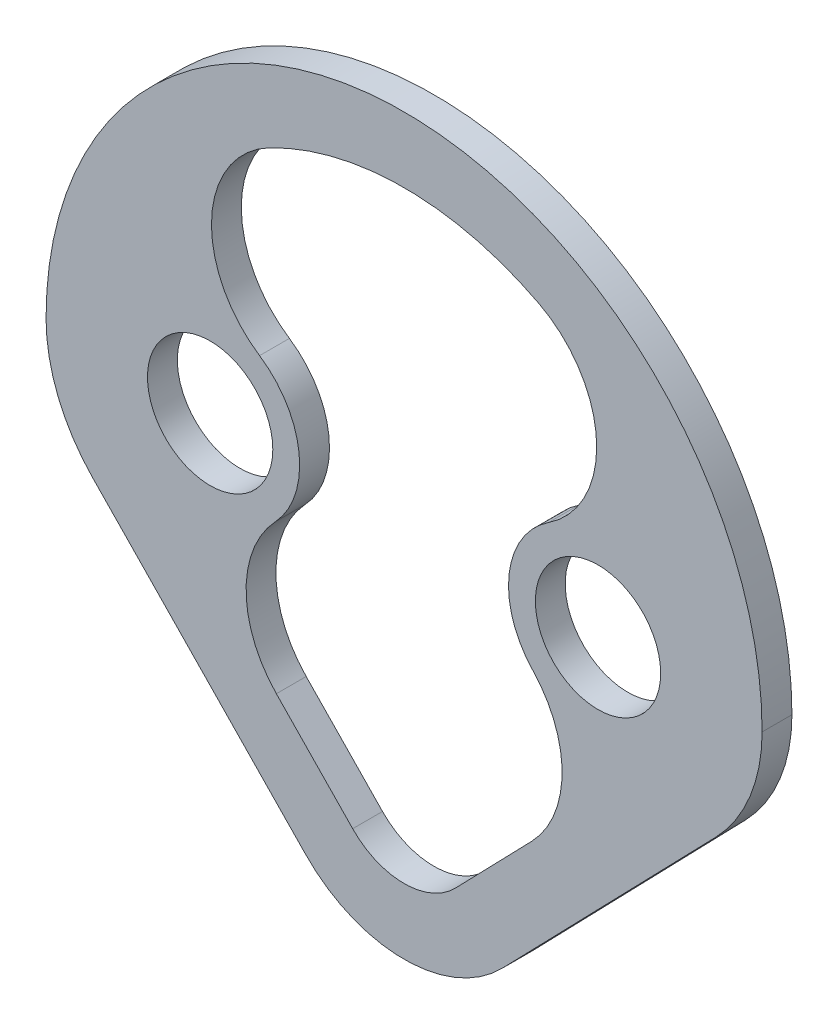
ISO-10303-21;
HEADER;
FILE_DESCRIPTION(('STEP AP214'),'2;1');
FILE_NAME('part.step','',(''),(''),'','','');
FILE_SCHEMA(('AUTOMOTIVE_DESIGN { 1 0 10303 214 1 1 1 1 }'));
ENDSEC;
DATA;
#1=APPLICATION_CONTEXT('core data for automotive mechanical design processes');
#2=APPLICATION_PROTOCOL_DEFINITION('international standard','automotive_design',2000,#1);
#3=PRODUCT_CONTEXT('',#1,'mechanical');
#4=PRODUCT('Part','Part','',(#3));
#5=PRODUCT_RELATED_PRODUCT_CATEGORY('part','',(#4));
#6=PRODUCT_DEFINITION_FORMATION('','',#4);
#7=PRODUCT_DEFINITION_CONTEXT('part definition',#1,'design');
#8=PRODUCT_DEFINITION('design','',#6,#7);
#9=PRODUCT_DEFINITION_SHAPE('','',#8);
#10=(LENGTH_UNIT() NAMED_UNIT(*) SI_UNIT(.MILLI.,.METRE.));
#11=(NAMED_UNIT(*) PLANE_ANGLE_UNIT() SI_UNIT($,.RADIAN.));
#12=(NAMED_UNIT(*) SI_UNIT($,.STERADIAN.) SOLID_ANGLE_UNIT());
#13=UNCERTAINTY_MEASURE_WITH_UNIT(LENGTH_MEASURE(1.E-05),#10,'distance_accuracy_value','');
#14=(GEOMETRIC_REPRESENTATION_CONTEXT(3) GLOBAL_UNCERTAINTY_ASSIGNED_CONTEXT((#13)) GLOBAL_UNIT_ASSIGNED_CONTEXT((#10,
#11,#12)) REPRESENTATION_CONTEXT('',''));
#15=CARTESIAN_POINT('',(0.,0.,0.));
#16=DIRECTION('',(0.,0.,1.));
#17=DIRECTION('',(1.,0.,0.));
#18=AXIS2_PLACEMENT_3D('',#15,#16,#17);
#19=CARTESIAN_POINT('',(-14.2807692307692,67.5147166108887,5.));
#20=DIRECTION('',(0.,0.,-1.));
#21=DIRECTION('',(-1.,0.,0.));
#22=AXIS2_PLACEMENT_3D('',#19,#20,#21);
#23=CYLINDRICAL_SURFACE('',#22,18.);
#24=CARTESIAN_POINT('',(-14.2807692307692,67.5147166108887,0.));
#25=DIRECTION('',(0.,0.,1.));
#26=DIRECTION('',(1.,0.,0.));
#27=AXIS2_PLACEMENT_3D('',#24,#25,#26);
#28=CIRCLE('',#27,18.);
#29=CARTESIAN_POINT('',(-22.5728287841191,83.4910036752757,0.));
#30=VERTEX_POINT('',#29);
#31=CARTESIAN_POINT('',(-24.2185314685315,52.5066893685858,0.));
#32=VERTEX_POINT('',#31);
#33=EDGE_CURVE('E230',#30,#32,#28,.T.);
#34=ORIENTED_EDGE('',*,*,#33,.F.);
#35=DIRECTION('',(0.,0.,-1.));
#36=VECTOR('',#35,1.);
#37=CARTESIAN_POINT('',(-22.5728287841191,83.4910036752757,5.));
#38=LINE('',#37,#36);
#39=CARTESIAN_POINT('',(-22.5728287841191,83.4910036752757,5.));
#40=VERTEX_POINT('',#39);
#41=EDGE_CURVE('E11',#40,#30,#38,.T.);
#42=ORIENTED_EDGE('',*,*,#41,.F.);
#43=CARTESIAN_POINT('',(-14.2807692307692,67.5147166108887,5.));
#44=DIRECTION('',(0.,0.,1.));
#45=DIRECTION('',(1.,0.,0.));
#46=AXIS2_PLACEMENT_3D('',#43,#44,#45);
#47=CIRCLE('',#46,18.);
#48=CARTESIAN_POINT('',(-24.2185314685315,52.5066893685858,5.));
#49=VERTEX_POINT('',#48);
#50=EDGE_CURVE('E352',#40,#49,#47,.T.);
#51=ORIENTED_EDGE('',*,*,#50,.T.);
#52=DIRECTION('',(0.,0.,-1.));
#53=VECTOR('',#52,1.);
#54=CARTESIAN_POINT('',(-24.2185314685315,52.5066893685858,5.));
#55=LINE('',#54,#53);
#56=EDGE_CURVE('E67',#49,#32,#55,.T.);
#57=ORIENTED_EDGE('',*,*,#56,.T.);
#58=EDGE_LOOP('',(#34,#42,#51,#57));
#59=FACE_BOUND('',#58,.T.);
#60=ADVANCED_FACE('F47',(#59),#23,.F.);
#61=CARTESIAN_POINT('',(0.,40.,5.));
#62=DIRECTION('',(0.,0.,-1.));
#63=DIRECTION('',(-1.,0.,0.));
#64=AXIS2_PLACEMENT_3D('',#61,#62,#63);
#65=CYLINDRICAL_SURFACE('',#64,49.);
#66=CARTESIAN_POINT('',(0.,40.,0.));
#67=DIRECTION('',(0.,0.,1.));
#68=DIRECTION('',(1.,0.,0.));
#69=AXIS2_PLACEMENT_3D('',#66,#67,#68);
#70=CIRCLE('',#69,49.);
#71=CARTESIAN_POINT('',(22.5728287841191,83.4910036752757,0.));
#72=VERTEX_POINT('',#71);
#73=EDGE_CURVE('E233',#72,#30,#70,.T.);
#74=ORIENTED_EDGE('',*,*,#73,.F.);
#75=DIRECTION('',(0.,0.,-1.));
#76=VECTOR('',#75,1.);
#77=CARTESIAN_POINT('',(22.5728287841191,83.4910036752757,5.));
#78=LINE('',#77,#76);
#79=CARTESIAN_POINT('',(22.5728287841191,83.4910036752757,5.));
#80=VERTEX_POINT('',#79);
#81=EDGE_CURVE('E58',#80,#72,#78,.T.);
#82=ORIENTED_EDGE('',*,*,#81,.F.);
#83=CARTESIAN_POINT('',(0.,40.,5.));
#84=DIRECTION('',(0.,0.,1.));
#85=DIRECTION('',(1.,0.,0.));
#86=AXIS2_PLACEMENT_3D('',#83,#84,#85);
#87=CIRCLE('',#86,49.);
#88=EDGE_CURVE('E355',#80,#40,#87,.T.);
#89=ORIENTED_EDGE('',*,*,#88,.T.);
#90=ORIENTED_EDGE('',*,*,#41,.T.);
#91=EDGE_LOOP('',(#74,#82,#89,#90));
#92=FACE_BOUND('',#91,.T.);
#93=ADVANCED_FACE('F396',(#92),#65,.F.);
#94=CARTESIAN_POINT('',(14.2807692307692,67.5147166108887,5.));
#95=DIRECTION('',(0.,0.,-1.));
#96=DIRECTION('',(-1.,0.,0.));
#97=AXIS2_PLACEMENT_3D('',#94,#95,#96);
#98=CYLINDRICAL_SURFACE('',#97,18.);
#99=CARTESIAN_POINT('',(14.2807692307692,67.5147166108887,0.));
#100=DIRECTION('',(0.,0.,1.));
#101=DIRECTION('',(1.,0.,0.));
#102=AXIS2_PLACEMENT_3D('',#99,#100,#101);
#103=CIRCLE('',#102,18.);
#104=CARTESIAN_POINT('',(24.2185314685315,52.5066893685858,0.));
#105=VERTEX_POINT('',#104);
#106=EDGE_CURVE('E237',#72,#105,#103,.F.);
#107=ORIENTED_EDGE('',*,*,#106,.T.);
#108=DIRECTION('',(0.,0.,-1.));
#109=VECTOR('',#108,1.);
#110=CARTESIAN_POINT('',(24.2185314685315,52.5066893685858,5.));
#111=LINE('',#110,#109);
#112=CARTESIAN_POINT('',(24.2185314685315,52.5066893685858,5.));
#113=VERTEX_POINT('',#112);
#114=EDGE_CURVE('E292',#113,#105,#111,.T.);
#115=ORIENTED_EDGE('',*,*,#114,.F.);
#116=CARTESIAN_POINT('',(14.2807692307692,67.5147166108887,5.));
#117=DIRECTION('',(0.,0.,1.));
#118=DIRECTION('',(1.,0.,0.));
#119=AXIS2_PLACEMENT_3D('',#116,#117,#118);
#120=CIRCLE('',#119,18.);
#121=EDGE_CURVE('E359',#80,#113,#120,.F.);
#122=ORIENTED_EDGE('',*,*,#121,.F.);
#123=ORIENTED_EDGE('',*,*,#81,.T.);
#124=EDGE_LOOP('',(#107,#115,#122,#123));
#125=FACE_BOUND('',#124,.T.);
#126=ADVANCED_FACE('F401',(#125),#98,.F.);
#127=CARTESIAN_POINT('',(32.5,40.,5.));
#128=DIRECTION('',(0.,0.,-1.));
#129=DIRECTION('',(-1.,0.,0.));
#130=AXIS2_PLACEMENT_3D('',#127,#128,#129);
#131=CYLINDRICAL_SURFACE('',#130,15.);
#132=CARTESIAN_POINT('',(32.5,40.,0.));
#133=DIRECTION('',(0.,0.,1.));
#134=DIRECTION('',(1.,0.,0.));
#135=AXIS2_PLACEMENT_3D('',#132,#133,#134);
#136=CIRCLE('',#135,15.);
#137=CARTESIAN_POINT('',(21.5819463825909,29.7142766317881,0.));
#138=VERTEX_POINT('',#137);
#139=EDGE_CURVE('E241',#105,#138,#136,.T.);
#140=ORIENTED_EDGE('',*,*,#139,.T.);
#141=DIRECTION('',(0.,0.,-1.));
#142=VECTOR('',#141,1.);
#143=CARTESIAN_POINT('',(21.5819463825909,29.7142766317881,5.));
#144=LINE('',#143,#142);
#145=CARTESIAN_POINT('',(21.5819463825909,29.7142766317881,5.));
#146=VERTEX_POINT('',#145);
#147=EDGE_CURVE('E288',#146,#138,#144,.T.);
#148=ORIENTED_EDGE('',*,*,#147,.F.);
#149=CARTESIAN_POINT('',(32.5,40.,5.));
#150=DIRECTION('',(0.,0.,1.));
#151=DIRECTION('',(1.,0.,0.));
#152=AXIS2_PLACEMENT_3D('',#149,#150,#151);
#153=CIRCLE('',#152,15.);
#154=EDGE_CURVE('E363',#113,#146,#153,.T.);
#155=ORIENTED_EDGE('',*,*,#154,.F.);
#156=ORIENTED_EDGE('',*,*,#114,.T.);
#157=EDGE_LOOP('',(#140,#148,#155,#156));
#158=FACE_BOUND('',#157,.T.);
#159=ADVANCED_FACE('F433',(#158),#131,.T.);
#160=CARTESIAN_POINT('',(8.48028204169995,17.3714085899339,5.));
#161=DIRECTION('',(0.,0.,-1.));
#162=DIRECTION('',(-1.,0.,0.));
#163=AXIS2_PLACEMENT_3D('',#160,#161,#162);
#164=CYLINDRICAL_SURFACE('',#163,18.);
#165=CARTESIAN_POINT('',(8.48028204169995,17.3714085899339,0.));
#166=DIRECTION('',(0.,0.,1.));
#167=DIRECTION('',(1.,0.,0.));
#168=AXIS2_PLACEMENT_3D('',#165,#166,#167);
#169=CIRCLE('',#168,18.);
#170=CARTESIAN_POINT('',(21.4059227911103,4.84432548103801,0.));
#171=VERTEX_POINT('',#170);
#172=EDGE_CURVE('E245',#138,#171,#169,.F.);
#173=ORIENTED_EDGE('',*,*,#172,.T.);
#174=DIRECTION('',(0.,0.,-1.));
#175=VECTOR('',#174,1.);
#176=CARTESIAN_POINT('',(21.4059227911103,4.84432548103801,5.));
#177=LINE('',#176,#175);
#178=CARTESIAN_POINT('',(21.4059227911103,4.84432548103801,5.));
#179=VERTEX_POINT('',#178);
#180=EDGE_CURVE('E284',#179,#171,#177,.T.);
#181=ORIENTED_EDGE('',*,*,#180,.F.);
#182=CARTESIAN_POINT('',(8.48028204169995,17.3714085899339,5.));
#183=DIRECTION('',(0.,0.,1.));
#184=DIRECTION('',(1.,0.,0.));
#185=AXIS2_PLACEMENT_3D('',#182,#183,#184);
#186=CIRCLE('',#185,18.);
#187=EDGE_CURVE('E367',#146,#179,#186,.F.);
#188=ORIENTED_EDGE('',*,*,#187,.F.);
#189=ORIENTED_EDGE('',*,*,#147,.T.);
#190=EDGE_LOOP('',(#173,#181,#188,#189));
#191=FACE_BOUND('',#190,.T.);
#192=ADVANCED_FACE('F429',(#191),#164,.F.);
#193=CARTESIAN_POINT('',(8.6170938329402,-8.35138873926392,5.));
#194=DIRECTION('',(0.718091152745016,-0.695949061605326,0.));
#195=DIRECTION('',(0.695949061605326,0.718091152745016,0.));
#196=AXIS2_PLACEMENT_3D('',#193,#194,#195);
#197=PLANE('',#196);
#198=DIRECTION('',(-0.695949061605326,-0.718091152745016,0.));
#199=VECTOR('',#198,1.);
#200=CARTESIAN_POINT('',(8.6170938329402,-8.35138873926392,0.));
#201=LINE('',#200,#199);
#202=CARTESIAN_POINT('',(8.6170938329402,-8.35138873926391,0.));
#203=VERTEX_POINT('',#202);
#204=EDGE_CURVE('E249',#171,#203,#201,.T.);
#205=ORIENTED_EDGE('',*,*,#204,.T.);
#206=DIRECTION('',(0.,0.,-1.));
#207=VECTOR('',#206,1.);
#208=CARTESIAN_POINT('',(8.6170938329402,-8.35138873926391,5.));
#209=LINE('',#208,#207);
#210=CARTESIAN_POINT('',(8.6170938329402,-8.35138873926391,5.));
#211=VERTEX_POINT('',#210);
#212=EDGE_CURVE('E281',#211,#203,#209,.T.);
#213=ORIENTED_EDGE('',*,*,#212,.F.);
#214=DIRECTION('',(-0.695949061605326,-0.718091152745016,0.));
#215=VECTOR('',#214,1.);
#216=CARTESIAN_POINT('',(8.6170938329402,-8.35138873926392,5.));
#217=LINE('',#216,#215);
#218=EDGE_CURVE('E371',#179,#211,#217,.T.);
#219=ORIENTED_EDGE('',*,*,#218,.F.);
#220=ORIENTED_EDGE('',*,*,#180,.T.);
#221=EDGE_LOOP('',(#205,#213,#219,#220));
#222=FACE_BOUND('',#221,.T.);
#223=ADVANCED_FACE('F426',(#222),#197,.F.);
#224=CARTESIAN_POINT('',(0.,0.,5.));
#225=DIRECTION('',(0.,0.,-1.));
#226=DIRECTION('',(-1.,0.,0.));
#227=AXIS2_PLACEMENT_3D('',#224,#225,#226);
#228=CYLINDRICAL_SURFACE('',#227,12.);
#229=CARTESIAN_POINT('',(0.,0.,0.));
#230=DIRECTION('',(0.,0.,1.));
#231=DIRECTION('',(1.,0.,0.));
#232=AXIS2_PLACEMENT_3D('',#229,#230,#231);
#233=CIRCLE('',#232,12.);
#234=CARTESIAN_POINT('',(-8.6170938329402,-8.35138873926391,0.));
#235=VERTEX_POINT('',#234);
#236=EDGE_CURVE('E253',#235,#203,#233,.T.);
#237=ORIENTED_EDGE('',*,*,#236,.F.);
#238=DIRECTION('',(0.,0.,-1.));
#239=VECTOR('',#238,1.);
#240=CARTESIAN_POINT('',(-8.6170938329402,-8.35138873926391,5.));
#241=LINE('',#240,#239);
#242=CARTESIAN_POINT('',(-8.6170938329402,-8.35138873926391,5.));
#243=VERTEX_POINT('',#242);
#244=EDGE_CURVE('E178',#243,#235,#241,.T.);
#245=ORIENTED_EDGE('',*,*,#244,.F.);
#246=CARTESIAN_POINT('',(0.,0.,5.));
#247=DIRECTION('',(0.,0.,1.));
#248=DIRECTION('',(1.,0.,0.));
#249=AXIS2_PLACEMENT_3D('',#246,#247,#248);
#250=CIRCLE('',#249,12.);
#251=EDGE_CURVE('E189',#243,#211,#250,.T.);
#252=ORIENTED_EDGE('',*,*,#251,.T.);
#253=ORIENTED_EDGE('',*,*,#212,.T.);
#254=EDGE_LOOP('',(#237,#245,#252,#253));
#255=FACE_BOUND('',#254,.T.);
#256=ADVANCED_FACE('F376',(#255),#228,.F.);
#257=CARTESIAN_POINT('',(-8.6170938329402,-8.35138873926392,5.));
#258=DIRECTION('',(0.718091152745016,0.695949061605326,0.));
#259=DIRECTION('',(-0.695949061605326,0.718091152745016,0.));
#260=AXIS2_PLACEMENT_3D('',#257,#258,#259);
#261=PLANE('',#260);
#262=DIRECTION('',(0.695949061605326,-0.718091152745016,0.));
#263=VECTOR('',#262,1.);
#264=CARTESIAN_POINT('',(-8.6170938329402,-8.35138873926392,0.));
#265=LINE('',#264,#263);
#266=CARTESIAN_POINT('',(-21.4059227911103,4.84432548103801,0.));
#267=VERTEX_POINT('',#266);
#268=EDGE_CURVE('E173',#267,#235,#265,.T.);
#269=ORIENTED_EDGE('',*,*,#268,.F.);
#270=DIRECTION('',(0.,0.,-1.));
#271=VECTOR('',#270,1.);
#272=CARTESIAN_POINT('',(-21.4059227911103,4.84432548103801,5.));
#273=LINE('',#272,#271);
#274=CARTESIAN_POINT('',(-21.4059227911103,4.84432548103801,5.));
#275=VERTEX_POINT('',#274);
#276=EDGE_CURVE('E168',#275,#267,#273,.T.);
#277=ORIENTED_EDGE('',*,*,#276,.F.);
#278=DIRECTION('',(0.695949061605326,-0.718091152745016,0.));
#279=VECTOR('',#278,1.);
#280=CARTESIAN_POINT('',(-8.6170938329402,-8.35138873926392,5.));
#281=LINE('',#280,#279);
#282=EDGE_CURVE('E171',#275,#243,#281,.T.);
#283=ORIENTED_EDGE('',*,*,#282,.T.);
#284=ORIENTED_EDGE('',*,*,#244,.T.);
#285=EDGE_LOOP('',(#269,#277,#283,#284));
#286=FACE_BOUND('',#285,.T.);
#287=ADVANCED_FACE('F170',(#286),#261,.T.);
#288=CARTESIAN_POINT('',(-8.48028204169995,17.3714085899339,5.));
#289=DIRECTION('',(0.,0.,-1.));
#290=DIRECTION('',(-1.,0.,0.));
#291=AXIS2_PLACEMENT_3D('',#288,#289,#290);
#292=CYLINDRICAL_SURFACE('',#291,18.);
#293=CARTESIAN_POINT('',(-8.48028204169995,17.3714085899339,0.));
#294=DIRECTION('',(0.,0.,1.));
#295=DIRECTION('',(1.,0.,0.));
#296=AXIS2_PLACEMENT_3D('',#293,#294,#295);
#297=CIRCLE('',#296,18.);
#298=CARTESIAN_POINT('',(-21.5819463825909,29.7142766317881,0.));
#299=VERTEX_POINT('',#298);
#300=EDGE_CURVE('E259',#299,#267,#297,.T.);
#301=ORIENTED_EDGE('',*,*,#300,.F.);
#302=DIRECTION('',(0.,0.,-1.));
#303=VECTOR('',#302,1.);
#304=CARTESIAN_POINT('',(-21.5819463825909,29.7142766317881,5.));
#305=LINE('',#304,#303);
#306=CARTESIAN_POINT('',(-21.5819463825909,29.7142766317881,5.));
#307=VERTEX_POINT('',#306);
#308=EDGE_CURVE('E116',#307,#299,#305,.T.);
#309=ORIENTED_EDGE('',*,*,#308,.F.);
#310=CARTESIAN_POINT('',(-8.48028204169995,17.3714085899339,5.));
#311=DIRECTION('',(0.,0.,1.));
#312=DIRECTION('',(1.,0.,0.));
#313=AXIS2_PLACEMENT_3D('',#310,#311,#312);
#314=CIRCLE('',#313,18.);
#315=EDGE_CURVE('E187',#307,#275,#314,.T.);
#316=ORIENTED_EDGE('',*,*,#315,.T.);
#317=ORIENTED_EDGE('',*,*,#276,.T.);
#318=EDGE_LOOP('',(#301,#309,#316,#317));
#319=FACE_BOUND('',#318,.T.);
#320=ADVANCED_FACE('F192',(#319),#292,.F.);
#321=CARTESIAN_POINT('',(-32.5,40.,5.));
#322=DIRECTION('',(0.,0.,-1.));
#323=DIRECTION('',(-1.,0.,0.));
#324=AXIS2_PLACEMENT_3D('',#321,#322,#323);
#325=CYLINDRICAL_SURFACE('',#324,27.5);
#326=CARTESIAN_POINT('',(-32.5,40.,0.));
#327=DIRECTION('',(0.,0.,1.));
#328=DIRECTION('',(1.,0.,0.));
#329=AXIS2_PLACEMENT_3D('',#326,#327,#328);
#330=CIRCLE('',#329,27.5);
#331=CARTESIAN_POINT('',(-52.247506700488,20.8614008058535,0.));
#332=VERTEX_POINT('',#331);
#333=CARTESIAN_POINT('',(-60.,40.,0.));
#334=VERTEX_POINT('',#333);
#335=EDGE_CURVE('E209',#332,#334,#330,.F.);
#336=ORIENTED_EDGE('',*,*,#335,.F.);
#337=DIRECTION('',(0.,0.,-1.));
#338=VECTOR('',#337,1.);
#339=CARTESIAN_POINT('',(-52.247506700488,20.8614008058535,5.));
#340=LINE('',#339,#338);
#341=CARTESIAN_POINT('',(-52.247506700488,20.8614008058535,5.));
#342=VERTEX_POINT('',#341);
#343=EDGE_CURVE('E51',#342,#332,#340,.T.);
#344=ORIENTED_EDGE('',*,*,#343,.F.);
#345=CARTESIAN_POINT('',(-32.5,40.,5.));
#346=DIRECTION('',(0.,0.,1.));
#347=DIRECTION('',(1.,0.,0.));
#348=AXIS2_PLACEMENT_3D('',#345,#346,#347);
#349=CIRCLE('',#348,27.5);
#350=CARTESIAN_POINT('',(-60.,40.,5.));
#351=VERTEX_POINT('',#350);
#352=EDGE_CURVE('E274',#342,#351,#349,.F.);
#353=ORIENTED_EDGE('',*,*,#352,.T.);
#354=DIRECTION('',(0.,0.,-1.));
#355=VECTOR('',#354,1.);
#356=CARTESIAN_POINT('',(-60.,40.,5.));
#357=LINE('',#356,#355);
#358=EDGE_CURVE('E208',#351,#334,#357,.T.);
#359=ORIENTED_EDGE('',*,*,#358,.T.);
#360=EDGE_LOOP('',(#336,#344,#353,#359));
#361=FACE_BOUND('',#360,.T.);
#362=ADVANCED_FACE('F49',(#361),#325,.T.);
#363=CARTESIAN_POINT('',(-16.5160965131354,-16.0068284169225,5.));
#364=DIRECTION('',(-0.718091152745016,-0.695949061605326,0.));
#365=DIRECTION('',(0.695949061605326,-0.718091152745016,0.));
#366=AXIS2_PLACEMENT_3D('',#363,#364,#365);
#367=PLANE('',#366);
#368=DIRECTION('',(-0.695949061605326,0.718091152745016,0.));
#369=VECTOR('',#368,1.);
#370=CARTESIAN_POINT('',(-16.5160965131354,-16.0068284169225,0.));
#371=LINE('',#370,#369);
#372=CARTESIAN_POINT('',(-16.5160965131354,-16.0068284169225,0.));
#373=VERTEX_POINT('',#372);
#374=EDGE_CURVE('E213',#373,#332,#371,.T.);
#375=ORIENTED_EDGE('',*,*,#374,.F.);
#376=DIRECTION('',(0.,0.,-1.));
#377=VECTOR('',#376,1.);
#378=CARTESIAN_POINT('',(-16.5160965131354,-16.0068284169225,5.));
#379=LINE('',#378,#377);
#380=CARTESIAN_POINT('',(-16.5160965131354,-16.0068284169225,5.));
#381=VERTEX_POINT('',#380);
#382=EDGE_CURVE('E311',#381,#373,#379,.T.);
#383=ORIENTED_EDGE('',*,*,#382,.F.);
#384=DIRECTION('',(-0.695949061605326,0.718091152745016,0.));
#385=VECTOR('',#384,1.);
#386=CARTESIAN_POINT('',(-16.5160965131354,-16.0068284169225,5.));
#387=LINE('',#386,#385);
#388=EDGE_CURVE('E322',#381,#342,#387,.T.);
#389=ORIENTED_EDGE('',*,*,#388,.T.);
#390=ORIENTED_EDGE('',*,*,#343,.T.);
#391=EDGE_LOOP('',(#375,#383,#389,#390));
#392=FACE_BOUND('',#391,.T.);
#393=ADVANCED_FACE('F320',(#392),#367,.T.);
#394=CARTESIAN_POINT('',(0.,0.,5.));
#395=DIRECTION('',(0.,0.,-1.));
#396=DIRECTION('',(-1.,0.,0.));
#397=AXIS2_PLACEMENT_3D('',#394,#395,#396);
#398=CYLINDRICAL_SURFACE('',#397,23.);
#399=CARTESIAN_POINT('',(0.,0.,0.));
#400=DIRECTION('',(0.,0.,1.));
#401=DIRECTION('',(1.,0.,0.));
#402=AXIS2_PLACEMENT_3D('',#399,#400,#401);
#403=CIRCLE('',#402,23.);
#404=CARTESIAN_POINT('',(16.5160965131354,-16.0068284169225,0.));
#405=VERTEX_POINT('',#404);
#406=EDGE_CURVE('E217',#373,#405,#403,.T.);
#407=ORIENTED_EDGE('',*,*,#406,.T.);
#408=DIRECTION('',(0.,0.,-1.));
#409=VECTOR('',#408,1.);
#410=CARTESIAN_POINT('',(16.5160965131354,-16.0068284169225,5.));
#411=LINE('',#410,#409);
#412=CARTESIAN_POINT('',(16.5160965131354,-16.0068284169225,5.));
#413=VERTEX_POINT('',#412);
#414=EDGE_CURVE('E308',#413,#405,#411,.T.);
#415=ORIENTED_EDGE('',*,*,#414,.F.);
#416=CARTESIAN_POINT('',(0.,0.,5.));
#417=DIRECTION('',(0.,0.,1.));
#418=DIRECTION('',(1.,0.,0.));
#419=AXIS2_PLACEMENT_3D('',#416,#417,#418);
#420=CIRCLE('',#419,23.);
#421=EDGE_CURVE('E341',#381,#413,#420,.T.);
#422=ORIENTED_EDGE('',*,*,#421,.F.);
#423=ORIENTED_EDGE('',*,*,#382,.T.);
#424=EDGE_LOOP('',(#407,#415,#422,#423));
#425=FACE_BOUND('',#424,.T.);
#426=ADVANCED_FACE('F331',(#425),#398,.T.);
#427=CARTESIAN_POINT('',(16.5160965131354,-16.0068284169225,5.));
#428=DIRECTION('',(-0.718091152745016,0.695949061605326,0.));
#429=DIRECTION('',(-0.695949061605326,-0.718091152745016,0.));
#430=AXIS2_PLACEMENT_3D('',#427,#428,#429);
#431=PLANE('',#430);
#432=DIRECTION('',(0.695949061605326,0.718091152745016,0.));
#433=VECTOR('',#432,1.);
#434=CARTESIAN_POINT('',(16.5160965131354,-16.0068284169225,0.));
#435=LINE('',#434,#433);
#436=CARTESIAN_POINT('',(52.247506700488,20.8614008058535,0.));
#437=VERTEX_POINT('',#436);
#438=EDGE_CURVE('E220',#405,#437,#435,.T.);
#439=ORIENTED_EDGE('',*,*,#438,.T.);
#440=DIRECTION('',(0.,0.,-1.));
#441=VECTOR('',#440,1.);
#442=CARTESIAN_POINT('',(52.247506700488,20.8614008058535,5.));
#443=LINE('',#442,#441);
#444=CARTESIAN_POINT('',(52.247506700488,20.8614008058535,5.));
#445=VERTEX_POINT('',#444);
#446=EDGE_CURVE('E304',#445,#437,#443,.T.);
#447=ORIENTED_EDGE('',*,*,#446,.F.);
#448=DIRECTION('',(0.695949061605326,0.718091152745016,0.));
#449=VECTOR('',#448,1.);
#450=CARTESIAN_POINT('',(16.5160965131354,-16.0068284169225,5.));
#451=LINE('',#450,#449);
#452=EDGE_CURVE('E336',#413,#445,#451,.T.);
#453=ORIENTED_EDGE('',*,*,#452,.F.);
#454=ORIENTED_EDGE('',*,*,#414,.T.);
#455=EDGE_LOOP('',(#439,#447,#453,#454));
#456=FACE_BOUND('',#455,.T.);
#457=ADVANCED_FACE('F334',(#456),#431,.F.);
#458=CARTESIAN_POINT('',(32.5,40.,5.));
#459=DIRECTION('',(0.,0.,-1.));
#460=DIRECTION('',(-1.,0.,0.));
#461=AXIS2_PLACEMENT_3D('',#458,#459,#460);
#462=CYLINDRICAL_SURFACE('',#461,27.5);
#463=CARTESIAN_POINT('',(32.5,40.,0.));
#464=DIRECTION('',(0.,0.,1.));
#465=DIRECTION('',(1.,0.,0.));
#466=AXIS2_PLACEMENT_3D('',#463,#464,#465);
#467=CIRCLE('',#466,27.5);
#468=CARTESIAN_POINT('',(60.,40.,0.));
#469=VERTEX_POINT('',#468);
#470=EDGE_CURVE('E223',#437,#469,#467,.T.);
#471=ORIENTED_EDGE('',*,*,#470,.T.);
#472=DIRECTION('',(0.,0.,-1.));
#473=VECTOR('',#472,1.);
#474=CARTESIAN_POINT('',(60.,40.,5.));
#475=LINE('',#474,#473);
#476=CARTESIAN_POINT('',(60.,40.,5.));
#477=VERTEX_POINT('',#476);
#478=EDGE_CURVE('E300',#477,#469,#475,.T.);
#479=ORIENTED_EDGE('',*,*,#478,.F.);
#480=CARTESIAN_POINT('',(32.5,40.,5.));
#481=DIRECTION('',(0.,0.,1.));
#482=DIRECTION('',(1.,0.,0.));
#483=AXIS2_PLACEMENT_3D('',#480,#481,#482);
#484=CIRCLE('',#483,27.5);
#485=EDGE_CURVE('E340',#445,#477,#484,.T.);
#486=ORIENTED_EDGE('',*,*,#485,.F.);
#487=ORIENTED_EDGE('',*,*,#446,.T.);
#488=EDGE_LOOP('',(#471,#479,#486,#487));
#489=FACE_BOUND('',#488,.T.);
#490=ADVANCED_FACE('F391',(#489),#462,.T.);
#491=CARTESIAN_POINT('',(-32.5,40.,5.));
#492=DIRECTION('',(0.,0.,-1.));
#493=DIRECTION('',(-1.,0.,0.));
#494=AXIS2_PLACEMENT_3D('',#491,#492,#493);
#495=CYLINDRICAL_SURFACE('',#494,10.5);
#496=CARTESIAN_POINT('',(-32.5,40.,5.));
#497=DIRECTION('',(0.,0.,1.));
#498=DIRECTION('',(1.,0.,0.));
#499=AXIS2_PLACEMENT_3D('',#496,#497,#498);
#500=CIRCLE('',#499,10.5);
#501=CARTESIAN_POINT('',(-22.,40.,5.));
#502=VERTEX_POINT('',#501);
#503=EDGE_CURVE('E197',#502,#502,#500,.T.);
#504=ORIENTED_EDGE('',*,*,#503,.T.);
#505=EDGE_LOOP('',(#504));
#506=FACE_BOUND('',#505,.T.);
#507=CARTESIAN_POINT('',(-32.5,40.,0.));
#508=DIRECTION('',(0.,0.,1.));
#509=DIRECTION('',(1.,0.,0.));
#510=AXIS2_PLACEMENT_3D('',#507,#508,#509);
#511=CIRCLE('',#510,10.5);
#512=CARTESIAN_POINT('',(-22.,40.,0.));
#513=VERTEX_POINT('',#512);
#514=EDGE_CURVE('E266',#513,#513,#511,.T.);
#515=ORIENTED_EDGE('',*,*,#514,.F.);
#516=EDGE_LOOP('',(#515));
#517=FACE_BOUND('',#516,.T.);
#518=ADVANCED_FACE('F382',(#506,#517),#495,.F.);
#519=CARTESIAN_POINT('',(-32.5,40.,5.));
#520=DIRECTION('',(0.,0.,-1.));
#521=DIRECTION('',(-1.,0.,0.));
#522=AXIS2_PLACEMENT_3D('',#519,#520,#521);
#523=CYLINDRICAL_SURFACE('',#522,15.);
#524=CARTESIAN_POINT('',(-32.5,40.,0.));
#525=DIRECTION('',(0.,0.,1.));
#526=DIRECTION('',(1.,0.,0.));
#527=AXIS2_PLACEMENT_3D('',#524,#525,#526);
#528=CIRCLE('',#527,15.);
#529=EDGE_CURVE('E262',#32,#299,#528,.F.);
#530=ORIENTED_EDGE('',*,*,#529,.F.);
#531=ORIENTED_EDGE('',*,*,#56,.F.);
#532=CARTESIAN_POINT('',(-32.5,40.,5.));
#533=DIRECTION('',(0.,0.,1.));
#534=DIRECTION('',(1.,0.,0.));
#535=AXIS2_PLACEMENT_3D('',#532,#533,#534);
#536=CIRCLE('',#535,15.);
#537=EDGE_CURVE('E194',#49,#307,#536,.F.);
#538=ORIENTED_EDGE('',*,*,#537,.T.);
#539=ORIENTED_EDGE('',*,*,#308,.T.);
#540=EDGE_LOOP('',(#530,#531,#538,#539));
#541=FACE_BOUND('',#540,.T.);
#542=ADVANCED_FACE('F379',(#541),#523,.T.);
#543=CARTESIAN_POINT('',(0.,40.,5.));
#544=DIRECTION('',(0.,0.,-1.));
#545=DIRECTION('',(-1.,0.,0.));
#546=AXIS2_PLACEMENT_3D('',#543,#544,#545);
#547=CYLINDRICAL_SURFACE('',#546,60.);
#548=CARTESIAN_POINT('',(0.,40.,0.));
#549=DIRECTION('',(0.,0.,1.));
#550=DIRECTION('',(1.,0.,0.));
#551=AXIS2_PLACEMENT_3D('',#548,#549,#550);
#552=CIRCLE('',#551,60.);
#553=EDGE_CURVE('E226',#469,#334,#552,.T.);
#554=ORIENTED_EDGE('',*,*,#553,.T.);
#555=ORIENTED_EDGE('',*,*,#358,.F.);
#556=CARTESIAN_POINT('',(0.,40.,5.));
#557=DIRECTION('',(0.,0.,1.));
#558=DIRECTION('',(1.,0.,0.));
#559=AXIS2_PLACEMENT_3D('',#556,#557,#558);
#560=CIRCLE('',#559,60.);
#561=EDGE_CURVE('E345',#477,#351,#560,.T.);
#562=ORIENTED_EDGE('',*,*,#561,.F.);
#563=ORIENTED_EDGE('',*,*,#478,.T.);
#564=EDGE_LOOP('',(#554,#555,#562,#563));
#565=FACE_BOUND('',#564,.T.);
#566=ADVANCED_FACE('F381',(#565),#547,.T.);
#567=CARTESIAN_POINT('',(32.5,40.,5.));
#568=DIRECTION('',(0.,0.,-1.));
#569=DIRECTION('',(-1.,0.,0.));
#570=AXIS2_PLACEMENT_3D('',#567,#568,#569);
#571=CYLINDRICAL_SURFACE('',#570,10.5);
#572=CARTESIAN_POINT('',(32.5,40.,5.));
#573=DIRECTION('',(0.,0.,1.));
#574=DIRECTION('',(1.,0.,0.));
#575=AXIS2_PLACEMENT_3D('',#572,#573,#574);
#576=CIRCLE('',#575,10.5);
#577=CARTESIAN_POINT('',(43.,40.,5.));
#578=VERTEX_POINT('',#577);
#579=EDGE_CURVE('E204',#578,#578,#576,.F.);
#580=ORIENTED_EDGE('',*,*,#579,.F.);
#581=EDGE_LOOP('',(#580));
#582=FACE_BOUND('',#581,.T.);
#583=CARTESIAN_POINT('',(32.5,40.,0.));
#584=DIRECTION('',(0.,0.,1.));
#585=DIRECTION('',(1.,0.,0.));
#586=AXIS2_PLACEMENT_3D('',#583,#584,#585);
#587=CIRCLE('',#586,10.5);
#588=CARTESIAN_POINT('',(43.,40.,0.));
#589=VERTEX_POINT('',#588);
#590=EDGE_CURVE('E270',#589,#589,#587,.F.);
#591=ORIENTED_EDGE('',*,*,#590,.T.);
#592=EDGE_LOOP('',(#591));
#593=FACE_BOUND('',#592,.T.);
#594=ADVANCED_FACE('F388',(#582,#593),#571,.F.);
#595=CARTESIAN_POINT('',(0.,0.,5.));
#596=DIRECTION('',(0.,0.,1.));
#597=DIRECTION('',(1.,0.,0.));
#598=AXIS2_PLACEMENT_3D('',#595,#596,#597);
#599=PLANE('',#598);
#600=ORIENTED_EDGE('',*,*,#352,.F.);
#601=ORIENTED_EDGE('',*,*,#388,.F.);
#602=ORIENTED_EDGE('',*,*,#421,.T.);
#603=ORIENTED_EDGE('',*,*,#452,.T.);
#604=ORIENTED_EDGE('',*,*,#485,.T.);
#605=ORIENTED_EDGE('',*,*,#561,.T.);
#606=EDGE_LOOP('',(#600,#601,#602,#603,#604,#605));
#607=FACE_BOUND('',#606,.T.);
#608=ORIENTED_EDGE('',*,*,#50,.F.);
#609=ORIENTED_EDGE('',*,*,#88,.F.);
#610=ORIENTED_EDGE('',*,*,#121,.T.);
#611=ORIENTED_EDGE('',*,*,#154,.T.);
#612=ORIENTED_EDGE('',*,*,#187,.T.);
#613=ORIENTED_EDGE('',*,*,#218,.T.);
#614=ORIENTED_EDGE('',*,*,#251,.F.);
#615=ORIENTED_EDGE('',*,*,#282,.F.);
#616=ORIENTED_EDGE('',*,*,#315,.F.);
#617=ORIENTED_EDGE('',*,*,#537,.F.);
#618=EDGE_LOOP('',(#608,#609,#610,#611,#612,#613,#614,#615,#616,#617));
#619=FACE_BOUND('',#618,.T.);
#620=ORIENTED_EDGE('',*,*,#503,.F.);
#621=EDGE_LOOP('',(#620));
#622=FACE_BOUND('',#621,.T.);
#623=ORIENTED_EDGE('',*,*,#579,.T.);
#624=EDGE_LOOP('',(#623));
#625=FACE_BOUND('',#624,.T.);
#626=ADVANCED_FACE('F184',(#607,#619,#622,#625),#599,.T.);
#627=CARTESIAN_POINT('',(0.,0.,0.));
#628=DIRECTION('',(0.,0.,1.));
#629=DIRECTION('',(1.,0.,0.));
#630=AXIS2_PLACEMENT_3D('',#627,#628,#629);
#631=PLANE('',#630);
#632=ORIENTED_EDGE('',*,*,#335,.T.);
#633=ORIENTED_EDGE('',*,*,#553,.F.);
#634=ORIENTED_EDGE('',*,*,#470,.F.);
#635=ORIENTED_EDGE('',*,*,#438,.F.);
#636=ORIENTED_EDGE('',*,*,#406,.F.);
#637=ORIENTED_EDGE('',*,*,#374,.T.);
#638=EDGE_LOOP('',(#632,#633,#634,#635,#636,#637));
#639=FACE_BOUND('',#638,.T.);
#640=ORIENTED_EDGE('',*,*,#33,.T.);
#641=ORIENTED_EDGE('',*,*,#529,.T.);
#642=ORIENTED_EDGE('',*,*,#300,.T.);
#643=ORIENTED_EDGE('',*,*,#268,.T.);
#644=ORIENTED_EDGE('',*,*,#236,.T.);
#645=ORIENTED_EDGE('',*,*,#204,.F.);
#646=ORIENTED_EDGE('',*,*,#172,.F.);
#647=ORIENTED_EDGE('',*,*,#139,.F.);
#648=ORIENTED_EDGE('',*,*,#106,.F.);
#649=ORIENTED_EDGE('',*,*,#73,.T.);
#650=EDGE_LOOP('',(#640,#641,#642,#643,#644,#645,#646,#647,#648,#649));
#651=FACE_BOUND('',#650,.T.);
#652=ORIENTED_EDGE('',*,*,#514,.T.);
#653=EDGE_LOOP('',(#652));
#654=FACE_BOUND('',#653,.T.);
#655=ORIENTED_EDGE('',*,*,#590,.F.);
#656=EDGE_LOOP('',(#655));
#657=FACE_BOUND('',#656,.T.);
#658=ADVANCED_FACE('F326',(#639,#651,#654,#657),#631,.F.);
#659=CLOSED_SHELL('',(#60,#93,#126,#159,#192,#223,#256,#287,#320,#362,#393,#426,#457,#490,#518,
#542,#566,#594,#626,#658));
#660=MANIFOLD_SOLID_BREP('B2',#659);
#661=ADVANCED_BREP_SHAPE_REPRESENTATION('',(#18,#660),#14);
#662=SHAPE_DEFINITION_REPRESENTATION(#9,#661);
ENDSEC;
END-ISO-10303-21;
